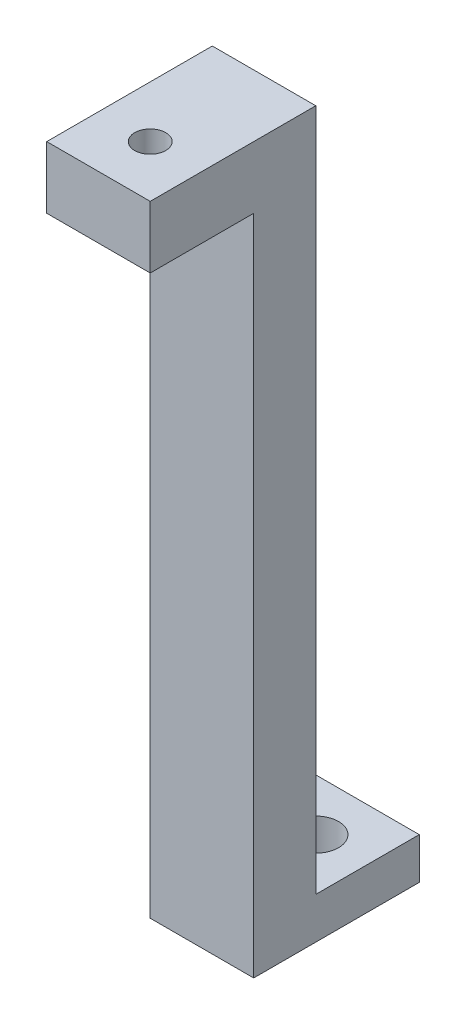
ISO-10303-21;
HEADER;
FILE_DESCRIPTION(('STEP AP214'),'2;1');
FILE_NAME('part.step','',(''),(''),'','','');
FILE_SCHEMA(('AUTOMOTIVE_DESIGN { 1 0 10303 214 1 1 1 1 }'));
ENDSEC;
DATA;
#1=APPLICATION_CONTEXT('core data for automotive mechanical design processes');
#2=APPLICATION_PROTOCOL_DEFINITION('international standard','automotive_design',2000,#1);
#3=PRODUCT_CONTEXT('',#1,'mechanical');
#4=PRODUCT('Part','Part','',(#3));
#5=PRODUCT_RELATED_PRODUCT_CATEGORY('part','',(#4));
#6=PRODUCT_DEFINITION_FORMATION('','',#4);
#7=PRODUCT_DEFINITION_CONTEXT('part definition',#1,'design');
#8=PRODUCT_DEFINITION('design','',#6,#7);
#9=PRODUCT_DEFINITION_SHAPE('','',#8);
#10=(LENGTH_UNIT() NAMED_UNIT(*) SI_UNIT(.MILLI.,.METRE.));
#11=(NAMED_UNIT(*) PLANE_ANGLE_UNIT() SI_UNIT($,.RADIAN.));
#12=(NAMED_UNIT(*) SI_UNIT($,.STERADIAN.) SOLID_ANGLE_UNIT());
#13=UNCERTAINTY_MEASURE_WITH_UNIT(LENGTH_MEASURE(1.E-05),#10,'distance_accuracy_value','');
#14=(GEOMETRIC_REPRESENTATION_CONTEXT(3) GLOBAL_UNCERTAINTY_ASSIGNED_CONTEXT((#13)) GLOBAL_UNIT_ASSIGNED_CONTEXT((#10,
#11,#12)) REPRESENTATION_CONTEXT('',''));
#15=CARTESIAN_POINT('',(0.,0.,0.));
#16=DIRECTION('',(0.,0.,1.));
#17=DIRECTION('',(1.,0.,0.));
#18=AXIS2_PLACEMENT_3D('',#15,#16,#17);
#19=CARTESIAN_POINT('',(-2.5,35.,5.5));
#20=DIRECTION('',(0.,0.,1.));
#21=DIRECTION('',(1.,0.,0.));
#22=AXIS2_PLACEMENT_3D('',#19,#20,#21);
#23=PLANE('',#22);
#24=DIRECTION('',(0.,-1.,0.));
#25=VECTOR('',#24,1.);
#26=CARTESIAN_POINT('',(2.5,35.,5.5));
#27=LINE('',#26,#25);
#28=CARTESIAN_POINT('',(2.5,32.,5.5));
#29=VERTEX_POINT('',#28);
#30=CARTESIAN_POINT('',(2.5,0.,5.5));
#31=VERTEX_POINT('',#30);
#32=EDGE_CURVE('E154',#29,#31,#27,.T.);
#33=ORIENTED_EDGE('',*,*,#32,.F.);
#34=DIRECTION('',(-1.,0.,0.));
#35=VECTOR('',#34,1.);
#36=CARTESIAN_POINT('',(-2.5,32.,5.5));
#37=LINE('',#36,#35);
#38=CARTESIAN_POINT('',(-2.5,32.,5.5));
#39=VERTEX_POINT('',#38);
#40=EDGE_CURVE('E122',#29,#39,#37,.T.);
#41=ORIENTED_EDGE('',*,*,#40,.T.);
#42=DIRECTION('',(0.,-1.,0.));
#43=VECTOR('',#42,1.);
#44=CARTESIAN_POINT('',(-2.5,35.,5.5));
#45=LINE('',#44,#43);
#46=CARTESIAN_POINT('',(-2.5,0.,5.5));
#47=VERTEX_POINT('',#46);
#48=EDGE_CURVE('E131',#39,#47,#45,.T.);
#49=ORIENTED_EDGE('',*,*,#48,.T.);
#50=DIRECTION('',(-1.,0.,0.));
#51=VECTOR('',#50,1.);
#52=CARTESIAN_POINT('',(-2.5,0.,5.5));
#53=LINE('',#52,#51);
#54=EDGE_CURVE('E141',#31,#47,#53,.T.);
#55=ORIENTED_EDGE('',*,*,#54,.F.);
#56=EDGE_LOOP('',(#33,#41,#49,#55));
#57=FACE_BOUND('',#56,.T.);
#58=ADVANCED_FACE('F39',(#57),#23,.T.);
#59=CARTESIAN_POINT('',(0.,2.,0.));
#60=DIRECTION('',(0.,-1.,0.));
#61=DIRECTION('',(0.,0.,-1.));
#62=AXIS2_PLACEMENT_3D('',#59,#60,#61);
#63=PLANE('',#62);
#64=DIRECTION('',(0.,0.,-1.));
#65=VECTOR('',#64,1.);
#66=CARTESIAN_POINT('',(2.5,2.,2.5));
#67=LINE('',#66,#65);
#68=CARTESIAN_POINT('',(2.5,2.,2.5));
#69=VERTEX_POINT('',#68);
#70=CARTESIAN_POINT('',(2.5,2.,-2.5));
#71=VERTEX_POINT('',#70);
#72=EDGE_CURVE('E165',#69,#71,#67,.T.);
#73=ORIENTED_EDGE('',*,*,#72,.T.);
#74=DIRECTION('',(-1.,0.,0.));
#75=VECTOR('',#74,1.);
#76=CARTESIAN_POINT('',(-2.5,2.,-2.5));
#77=LINE('',#76,#75);
#78=CARTESIAN_POINT('',(-2.5,2.,-2.5));
#79=VERTEX_POINT('',#78);
#80=EDGE_CURVE('E80',#71,#79,#77,.T.);
#81=ORIENTED_EDGE('',*,*,#80,.T.);
#82=DIRECTION('',(0.,0.,1.));
#83=VECTOR('',#82,1.);
#84=CARTESIAN_POINT('',(-2.5,2.,2.5));
#85=LINE('',#84,#83);
#86=CARTESIAN_POINT('',(-2.5,2.,2.5));
#87=VERTEX_POINT('',#86);
#88=EDGE_CURVE('E169',#79,#87,#85,.T.);
#89=ORIENTED_EDGE('',*,*,#88,.T.);
#90=DIRECTION('',(1.,0.,0.));
#91=VECTOR('',#90,1.);
#92=CARTESIAN_POINT('',(-2.5,2.,2.5));
#93=LINE('',#92,#91);
#94=EDGE_CURVE('E172',#87,#69,#93,.T.);
#95=ORIENTED_EDGE('',*,*,#94,.T.);
#96=EDGE_LOOP('',(#73,#81,#89,#95));
#97=FACE_BOUND('',#96,.T.);
#98=CARTESIAN_POINT('',(0.,2.,0.));
#99=DIRECTION('',(0.,1.,0.));
#100=DIRECTION('',(0.,0.,1.));
#101=AXIS2_PLACEMENT_3D('',#98,#99,#100);
#102=CIRCLE('',#101,1.1);
#103=CARTESIAN_POINT('',(0.,2.,1.1));
#104=VERTEX_POINT('',#103);
#105=EDGE_CURVE('E159',#104,#104,#102,.T.);
#106=ORIENTED_EDGE('',*,*,#105,.F.);
#107=EDGE_LOOP('',(#106));
#108=FACE_BOUND('',#107,.T.);
#109=ADVANCED_FACE('F194',(#97,#108),#63,.F.);
#110=CARTESIAN_POINT('',(0.,0.,0.));
#111=DIRECTION('',(0.,-1.,0.));
#112=DIRECTION('',(0.,0.,-1.));
#113=AXIS2_PLACEMENT_3D('',#110,#111,#112);
#114=PLANE('',#113);
#115=DIRECTION('',(0.,0.,-1.));
#116=VECTOR('',#115,1.);
#117=CARTESIAN_POINT('',(2.5,0.,2.5));
#118=LINE('',#117,#116);
#119=CARTESIAN_POINT('',(2.5,0.,-2.5));
#120=VERTEX_POINT('',#119);
#121=EDGE_CURVE('E162',#31,#120,#118,.T.);
#122=ORIENTED_EDGE('',*,*,#121,.F.);
#123=ORIENTED_EDGE('',*,*,#54,.T.);
#124=DIRECTION('',(0.,0.,1.));
#125=VECTOR('',#124,1.);
#126=CARTESIAN_POINT('',(-2.5,0.,2.5));
#127=LINE('',#126,#125);
#128=CARTESIAN_POINT('',(-2.5,0.,-2.5));
#129=VERTEX_POINT('',#128);
#130=EDGE_CURVE('E167',#129,#47,#127,.T.);
#131=ORIENTED_EDGE('',*,*,#130,.F.);
#132=DIRECTION('',(-1.,0.,0.));
#133=VECTOR('',#132,1.);
#134=CARTESIAN_POINT('',(-2.5,0.,-2.5));
#135=LINE('',#134,#133);
#136=EDGE_CURVE('E77',#120,#129,#135,.T.);
#137=ORIENTED_EDGE('',*,*,#136,.F.);
#138=EDGE_LOOP('',(#122,#123,#131,#137));
#139=FACE_BOUND('',#138,.T.);
#140=CARTESIAN_POINT('',(0.,0.,0.));
#141=DIRECTION('',(0.,1.,0.));
#142=DIRECTION('',(0.,0.,1.));
#143=AXIS2_PLACEMENT_3D('',#140,#141,#142);
#144=CIRCLE('',#143,1.1);
#145=CARTESIAN_POINT('',(0.,0.,1.1));
#146=VERTEX_POINT('',#145);
#147=EDGE_CURVE('E153',#146,#146,#144,.T.);
#148=ORIENTED_EDGE('',*,*,#147,.T.);
#149=EDGE_LOOP('',(#148));
#150=FACE_BOUND('',#149,.T.);
#151=ADVANCED_FACE('F181',(#139,#150),#114,.T.);
#152=CARTESIAN_POINT('',(2.5,2.,2.5));
#153=DIRECTION('',(-1.,0.,0.));
#154=DIRECTION('',(0.,0.,1.));
#155=AXIS2_PLACEMENT_3D('',#152,#153,#154);
#156=PLANE('',#155);
#157=ORIENTED_EDGE('',*,*,#121,.T.);
#158=DIRECTION('',(0.,-1.,0.));
#159=VECTOR('',#158,1.);
#160=CARTESIAN_POINT('',(2.5,2.,-2.5));
#161=LINE('',#160,#159);
#162=EDGE_CURVE('E11',#71,#120,#161,.T.);
#163=ORIENTED_EDGE('',*,*,#162,.F.);
#164=ORIENTED_EDGE('',*,*,#72,.F.);
#165=DIRECTION('',(0.,-1.,0.));
#166=VECTOR('',#165,1.);
#167=CARTESIAN_POINT('',(2.5,35.,2.5));
#168=LINE('',#167,#166);
#169=CARTESIAN_POINT('',(2.5,35.,2.5));
#170=VERTEX_POINT('',#169);
#171=EDGE_CURVE('E63',#170,#69,#168,.T.);
#172=ORIENTED_EDGE('',*,*,#171,.F.);
#173=DIRECTION('',(0.,0.,1.));
#174=VECTOR('',#173,1.);
#175=CARTESIAN_POINT('',(2.5,35.,2.5));
#176=LINE('',#175,#174);
#177=CARTESIAN_POINT('',(2.5,35.,10.5));
#178=VERTEX_POINT('',#177);
#179=EDGE_CURVE('E147',#170,#178,#176,.T.);
#180=ORIENTED_EDGE('',*,*,#179,.T.);
#181=DIRECTION('',(0.,1.,0.));
#182=VECTOR('',#181,1.);
#183=CARTESIAN_POINT('',(2.5,32.,10.5));
#184=LINE('',#183,#182);
#185=CARTESIAN_POINT('',(2.5,32.,10.5));
#186=VERTEX_POINT('',#185);
#187=EDGE_CURVE('E121',#186,#178,#184,.T.);
#188=ORIENTED_EDGE('',*,*,#187,.F.);
#189=DIRECTION('',(0.,0.,-1.));
#190=VECTOR('',#189,1.);
#191=CARTESIAN_POINT('',(2.5,32.,5.5));
#192=LINE('',#191,#190);
#193=EDGE_CURVE('E126',#186,#29,#192,.T.);
#194=ORIENTED_EDGE('',*,*,#193,.T.);
#195=ORIENTED_EDGE('',*,*,#32,.T.);
#196=EDGE_LOOP('',(#157,#163,#164,#172,#180,#188,#194,#195));
#197=FACE_BOUND('',#196,.T.);
#198=ADVANCED_FACE('F41',(#197),#156,.F.);
#199=CARTESIAN_POINT('',(-2.5,2.,-2.5));
#200=DIRECTION('',(0.,0.,1.));
#201=DIRECTION('',(1.,0.,0.));
#202=AXIS2_PLACEMENT_3D('',#199,#200,#201);
#203=PLANE('',#202);
#204=ORIENTED_EDGE('',*,*,#136,.T.);
#205=DIRECTION('',(0.,-1.,0.));
#206=VECTOR('',#205,1.);
#207=CARTESIAN_POINT('',(-2.5,2.,-2.5));
#208=LINE('',#207,#206);
#209=EDGE_CURVE('E47',#79,#129,#208,.T.);
#210=ORIENTED_EDGE('',*,*,#209,.F.);
#211=ORIENTED_EDGE('',*,*,#80,.F.);
#212=ORIENTED_EDGE('',*,*,#162,.T.);
#213=EDGE_LOOP('',(#204,#210,#211,#212));
#214=FACE_BOUND('',#213,.T.);
#215=ADVANCED_FACE('F197',(#214),#203,.F.);
#216=CARTESIAN_POINT('',(-2.5,2.,2.5));
#217=DIRECTION('',(1.,0.,0.));
#218=DIRECTION('',(0.,0.,-1.));
#219=AXIS2_PLACEMENT_3D('',#216,#217,#218);
#220=PLANE('',#219);
#221=ORIENTED_EDGE('',*,*,#130,.T.);
#222=ORIENTED_EDGE('',*,*,#48,.F.);
#223=DIRECTION('',(0.,0.,1.));
#224=VECTOR('',#223,1.);
#225=CARTESIAN_POINT('',(-2.5,32.,5.5));
#226=LINE('',#225,#224);
#227=CARTESIAN_POINT('',(-2.5,32.,10.5));
#228=VERTEX_POINT('',#227);
#229=EDGE_CURVE('E54',#39,#228,#226,.T.);
#230=ORIENTED_EDGE('',*,*,#229,.T.);
#231=DIRECTION('',(0.,1.,0.));
#232=VECTOR('',#231,1.);
#233=CARTESIAN_POINT('',(-2.5,32.,10.5));
#234=LINE('',#233,#232);
#235=CARTESIAN_POINT('',(-2.5,35.,10.5));
#236=VERTEX_POINT('',#235);
#237=EDGE_CURVE('E113',#228,#236,#234,.T.);
#238=ORIENTED_EDGE('',*,*,#237,.T.);
#239=DIRECTION('',(0.,0.,-1.));
#240=VECTOR('',#239,1.);
#241=CARTESIAN_POINT('',(-2.5,35.,2.5));
#242=LINE('',#241,#240);
#243=CARTESIAN_POINT('',(-2.5,35.,2.5));
#244=VERTEX_POINT('',#243);
#245=EDGE_CURVE('E143',#236,#244,#242,.T.);
#246=ORIENTED_EDGE('',*,*,#245,.T.);
#247=DIRECTION('',(0.,-1.,0.));
#248=VECTOR('',#247,1.);
#249=CARTESIAN_POINT('',(-2.5,35.,2.5));
#250=LINE('',#249,#248);
#251=EDGE_CURVE('E149',#244,#87,#250,.T.);
#252=ORIENTED_EDGE('',*,*,#251,.T.);
#253=ORIENTED_EDGE('',*,*,#88,.F.);
#254=ORIENTED_EDGE('',*,*,#209,.T.);
#255=EDGE_LOOP('',(#221,#222,#230,#238,#246,#252,#253,#254));
#256=FACE_BOUND('',#255,.T.);
#257=ADVANCED_FACE('F130',(#256),#220,.F.);
#258=CARTESIAN_POINT('',(0.,2.,0.));
#259=DIRECTION('',(0.,-1.,0.));
#260=DIRECTION('',(0.,0.,-1.));
#261=AXIS2_PLACEMENT_3D('',#258,#259,#260);
#262=CYLINDRICAL_SURFACE('',#261,1.1);
#263=ORIENTED_EDGE('',*,*,#105,.T.);
#264=EDGE_LOOP('',(#263));
#265=FACE_BOUND('',#264,.T.);
#266=ORIENTED_EDGE('',*,*,#147,.F.);
#267=EDGE_LOOP('',(#266));
#268=FACE_BOUND('',#267,.T.);
#269=ADVANCED_FACE('F203',(#265,#268),#262,.F.);
#270=CARTESIAN_POINT('',(-2.5,35.,2.5));
#271=DIRECTION('',(0.,0.,-1.));
#272=DIRECTION('',(-1.,0.,0.));
#273=AXIS2_PLACEMENT_3D('',#270,#271,#272);
#274=PLANE('',#273);
#275=ORIENTED_EDGE('',*,*,#94,.F.);
#276=ORIENTED_EDGE('',*,*,#251,.F.);
#277=DIRECTION('',(1.,0.,0.));
#278=VECTOR('',#277,1.);
#279=CARTESIAN_POINT('',(-2.5,35.,2.5));
#280=LINE('',#279,#278);
#281=EDGE_CURVE('E145',#244,#170,#280,.T.);
#282=ORIENTED_EDGE('',*,*,#281,.T.);
#283=ORIENTED_EDGE('',*,*,#171,.T.);
#284=EDGE_LOOP('',(#275,#276,#282,#283));
#285=FACE_BOUND('',#284,.T.);
#286=ADVANCED_FACE('F214',(#285),#274,.T.);
#287=CARTESIAN_POINT('',(0.,35.,0.));
#288=DIRECTION('',(0.,1.,0.));
#289=DIRECTION('',(0.,0.,1.));
#290=AXIS2_PLACEMENT_3D('',#287,#288,#289);
#291=PLANE('',#290);
#292=ORIENTED_EDGE('',*,*,#245,.F.);
#293=DIRECTION('',(1.,0.,0.));
#294=VECTOR('',#293,1.);
#295=CARTESIAN_POINT('',(-2.5,35.,10.5));
#296=LINE('',#295,#294);
#297=EDGE_CURVE('E118',#236,#178,#296,.T.);
#298=ORIENTED_EDGE('',*,*,#297,.T.);
#299=ORIENTED_EDGE('',*,*,#179,.F.);
#300=ORIENTED_EDGE('',*,*,#281,.F.);
#301=EDGE_LOOP('',(#292,#298,#299,#300));
#302=FACE_BOUND('',#301,.T.);
#303=CARTESIAN_POINT('',(0.,35.,8.00000000000001));
#304=DIRECTION('',(0.,1.,0.));
#305=DIRECTION('',(0.,0.,1.));
#306=AXIS2_PLACEMENT_3D('',#303,#304,#305);
#307=CIRCLE('',#306,0.75);
#308=CARTESIAN_POINT('',(0.,35.,8.75000000000001));
#309=VERTEX_POINT('',#308);
#310=EDGE_CURVE('E136',#309,#309,#307,.T.);
#311=ORIENTED_EDGE('',*,*,#310,.F.);
#312=EDGE_LOOP('',(#311));
#313=FACE_BOUND('',#312,.T.);
#314=ADVANCED_FACE('F190',(#302,#313),#291,.T.);
#315=CARTESIAN_POINT('',(-2.5,32.,10.5));
#316=DIRECTION('',(0.,0.,1.));
#317=DIRECTION('',(1.,0.,0.));
#318=AXIS2_PLACEMENT_3D('',#315,#316,#317);
#319=PLANE('',#318);
#320=ORIENTED_EDGE('',*,*,#297,.F.);
#321=ORIENTED_EDGE('',*,*,#237,.F.);
#322=DIRECTION('',(1.,0.,0.));
#323=VECTOR('',#322,1.);
#324=CARTESIAN_POINT('',(-2.5,32.,10.5));
#325=LINE('',#324,#323);
#326=EDGE_CURVE('E116',#228,#186,#325,.T.);
#327=ORIENTED_EDGE('',*,*,#326,.T.);
#328=ORIENTED_EDGE('',*,*,#187,.T.);
#329=EDGE_LOOP('',(#320,#321,#327,#328));
#330=FACE_BOUND('',#329,.T.);
#331=ADVANCED_FACE('F114',(#330),#319,.T.);
#332=CARTESIAN_POINT('',(0.,32.,0.));
#333=DIRECTION('',(0.,1.,0.));
#334=DIRECTION('',(0.,0.,1.));
#335=AXIS2_PLACEMENT_3D('',#332,#333,#334);
#336=PLANE('',#335);
#337=CARTESIAN_POINT('',(0.,32.,8.00000000000001));
#338=DIRECTION('',(0.,1.,0.));
#339=DIRECTION('',(0.,0.,1.));
#340=AXIS2_PLACEMENT_3D('',#337,#338,#339);
#341=CIRCLE('',#340,0.75);
#342=CARTESIAN_POINT('',(0.,32.,8.75000000000001));
#343=VERTEX_POINT('',#342);
#344=EDGE_CURVE('E133',#343,#343,#341,.T.);
#345=ORIENTED_EDGE('',*,*,#344,.T.);
#346=EDGE_LOOP('',(#345));
#347=FACE_BOUND('',#346,.T.);
#348=ORIENTED_EDGE('',*,*,#229,.F.);
#349=ORIENTED_EDGE('',*,*,#40,.F.);
#350=ORIENTED_EDGE('',*,*,#193,.F.);
#351=ORIENTED_EDGE('',*,*,#326,.F.);
#352=EDGE_LOOP('',(#348,#349,#350,#351));
#353=FACE_BOUND('',#352,.T.);
#354=ADVANCED_FACE('F125',(#347,#353),#336,.F.);
#355=CARTESIAN_POINT('',(0.,32.,8.00000000000001));
#356=DIRECTION('',(0.,1.,0.));
#357=DIRECTION('',(0.,0.,1.));
#358=AXIS2_PLACEMENT_3D('',#355,#356,#357);
#359=CYLINDRICAL_SURFACE('',#358,0.75);
#360=ORIENTED_EDGE('',*,*,#344,.F.);
#361=EDGE_LOOP('',(#360));
#362=FACE_BOUND('',#361,.T.);
#363=ORIENTED_EDGE('',*,*,#310,.T.);
#364=EDGE_LOOP('',(#363));
#365=FACE_BOUND('',#364,.T.);
#366=ADVANCED_FACE('F266',(#362,#365),#359,.F.);
#367=CLOSED_SHELL('',(#58,#109,#151,#198,#215,#257,#269,#286,#314,#331,#354,#366));
#368=MANIFOLD_SOLID_BREP('B2',#367);
#369=ADVANCED_BREP_SHAPE_REPRESENTATION('',(#18,#368),#14);
#370=SHAPE_DEFINITION_REPRESENTATION(#9,#369);
ENDSEC;
END-ISO-10303-21;
